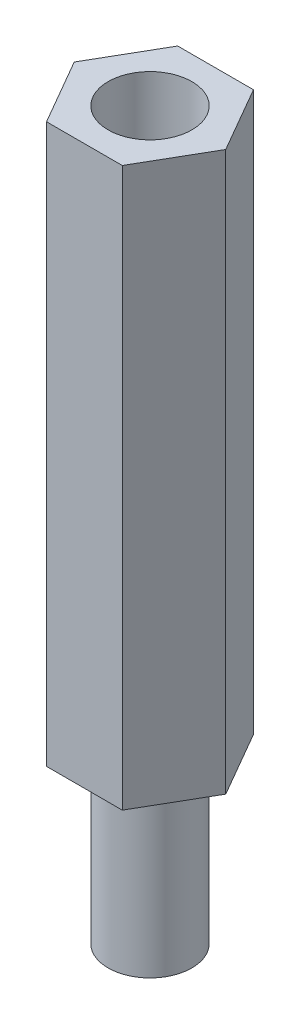
ISO-10303-21;
HEADER;
FILE_DESCRIPTION(('STEP AP214'),'2;1');
FILE_NAME('part.step','',(''),(''),'','','');
FILE_SCHEMA(('AUTOMOTIVE_DESIGN { 1 0 10303 214 1 1 1 1 }'));
ENDSEC;
DATA;
#1=APPLICATION_CONTEXT('core data for automotive mechanical design processes');
#2=APPLICATION_PROTOCOL_DEFINITION('international standard','automotive_design',2000,#1);
#3=PRODUCT_CONTEXT('',#1,'mechanical');
#4=PRODUCT('Part','Part','',(#3));
#5=PRODUCT_RELATED_PRODUCT_CATEGORY('part','',(#4));
#6=PRODUCT_DEFINITION_FORMATION('','',#4);
#7=PRODUCT_DEFINITION_CONTEXT('part definition',#1,'design');
#8=PRODUCT_DEFINITION('design','',#6,#7);
#9=PRODUCT_DEFINITION_SHAPE('','',#8);
#10=(LENGTH_UNIT() NAMED_UNIT(*) SI_UNIT(.MILLI.,.METRE.));
#11=(NAMED_UNIT(*) PLANE_ANGLE_UNIT() SI_UNIT($,.RADIAN.));
#12=(NAMED_UNIT(*) SI_UNIT($,.STERADIAN.) SOLID_ANGLE_UNIT());
#13=UNCERTAINTY_MEASURE_WITH_UNIT(LENGTH_MEASURE(1.E-05),#10,'distance_accuracy_value','');
#14=(GEOMETRIC_REPRESENTATION_CONTEXT(3) GLOBAL_UNCERTAINTY_ASSIGNED_CONTEXT((#13)) GLOBAL_UNIT_ASSIGNED_CONTEXT((#10,
#11,#12)) REPRESENTATION_CONTEXT('',''));
#15=CARTESIAN_POINT('',(0.,0.,0.));
#16=DIRECTION('',(0.,0.,1.));
#17=DIRECTION('',(1.,0.,0.));
#18=AXIS2_PLACEMENT_3D('',#15,#16,#17);
#19=CARTESIAN_POINT('',(0.,-6.,0.));
#20=DIRECTION('',(0.,1.,0.));
#21=DIRECTION('',(0.,0.,1.));
#22=AXIS2_PLACEMENT_3D('',#19,#20,#21);
#23=CYLINDRICAL_SURFACE('',#22,1.5);
#24=CARTESIAN_POINT('',(0.,-6.,0.));
#25=DIRECTION('',(0.,-1.,0.));
#26=DIRECTION('',(0.,0.,-1.));
#27=AXIS2_PLACEMENT_3D('',#24,#25,#26);
#28=CIRCLE('',#27,1.5);
#29=CARTESIAN_POINT('',(0.,-6.,-1.5));
#30=VERTEX_POINT('',#29);
#31=EDGE_CURVE('E11',#30,#30,#28,.T.);
#32=ORIENTED_EDGE('',*,*,#31,.F.);
#33=EDGE_LOOP('',(#32));
#34=FACE_BOUND('',#33,.T.);
#35=CARTESIAN_POINT('',(0.,0.,0.));
#36=DIRECTION('',(0.,-1.,0.));
#37=DIRECTION('',(0.,0.,-1.));
#38=AXIS2_PLACEMENT_3D('',#35,#36,#37);
#39=CIRCLE('',#38,1.5);
#40=CARTESIAN_POINT('',(0.,0.,-1.5));
#41=VERTEX_POINT('',#40);
#42=EDGE_CURVE('E46',#41,#41,#39,.T.);
#43=ORIENTED_EDGE('',*,*,#42,.T.);
#44=EDGE_LOOP('',(#43));
#45=FACE_BOUND('',#44,.T.);
#46=ADVANCED_FACE('F43',(#34,#45),#23,.T.);
#47=CARTESIAN_POINT('',(0.,-6.,0.));
#48=DIRECTION('',(0.,-1.,0.));
#49=DIRECTION('',(0.,0.,-1.));
#50=AXIS2_PLACEMENT_3D('',#47,#48,#49);
#51=PLANE('',#50);
#52=ORIENTED_EDGE('',*,*,#31,.T.);
#53=EDGE_LOOP('',(#52));
#54=FACE_BOUND('',#53,.T.);
#55=ADVANCED_FACE('F58',(#54),#51,.T.);
#56=CARTESIAN_POINT('',(0.,0.,0.));
#57=DIRECTION('',(0.,-1.,0.));
#58=DIRECTION('',(0.,0.,-1.));
#59=AXIS2_PLACEMENT_3D('',#56,#57,#58);
#60=PLANE('',#59);
#61=ORIENTED_EDGE('',*,*,#42,.F.);
#62=EDGE_LOOP('',(#61));
#63=FACE_BOUND('',#62,.T.);
#64=ADVANCED_FACE('F56',(#63),#60,.F.);
#65=CLOSED_SHELL('',(#46,#55,#64));
#66=MANIFOLD_SOLID_BREP('B2',#65);
#67=CARTESIAN_POINT('',(0.,20.,0.));
#68=DIRECTION('',(0.,1.,0.));
#69=DIRECTION('',(0.,0.,1.));
#70=AXIS2_PLACEMENT_3D('',#67,#68,#69);
#71=PLANE('',#70);
#72=DIRECTION('',(0.5,0.,-0.866025403784438));
#73=VECTOR('',#72,1.);
#74=CARTESIAN_POINT('',(1.35677313259562,20.,2.35));
#75=LINE('',#74,#73);
#76=CARTESIAN_POINT('',(1.35677313259562,20.,2.35));
#77=VERTEX_POINT('',#76);
#78=CARTESIAN_POINT('',(2.71354626519124,20.,0.));
#79=VERTEX_POINT('',#78);
#80=EDGE_CURVE('E180',#77,#79,#75,.T.);
#81=ORIENTED_EDGE('',*,*,#80,.T.);
#82=DIRECTION('',(-0.5,0.,-0.866025403784438));
#83=VECTOR('',#82,1.);
#84=CARTESIAN_POINT('',(2.71354626519124,20.,0.));
#85=LINE('',#84,#83);
#86=CARTESIAN_POINT('',(1.35677313259562,20.,-2.35));
#87=VERTEX_POINT('',#86);
#88=EDGE_CURVE('E138',#79,#87,#85,.T.);
#89=ORIENTED_EDGE('',*,*,#88,.T.);
#90=DIRECTION('',(-1.,0.,0.));
#91=VECTOR('',#90,1.);
#92=CARTESIAN_POINT('',(1.35677313259562,20.,-2.35));
#93=LINE('',#92,#91);
#94=CARTESIAN_POINT('',(-1.35677313259562,20.,-2.35));
#95=VERTEX_POINT('',#94);
#96=EDGE_CURVE('E151',#87,#95,#93,.T.);
#97=ORIENTED_EDGE('',*,*,#96,.T.);
#98=DIRECTION('',(-0.5,0.,0.866025403784439));
#99=VECTOR('',#98,1.);
#100=CARTESIAN_POINT('',(-1.35677313259562,20.,-2.35));
#101=LINE('',#100,#99);
#102=CARTESIAN_POINT('',(-2.71354626519124,20.,0.));
#103=VERTEX_POINT('',#102);
#104=EDGE_CURVE('E145',#95,#103,#101,.T.);
#105=ORIENTED_EDGE('',*,*,#104,.T.);
#106=DIRECTION('',(0.5,0.,0.866025403784438));
#107=VECTOR('',#106,1.);
#108=CARTESIAN_POINT('',(-2.71354626519124,20.,0.));
#109=LINE('',#108,#107);
#110=CARTESIAN_POINT('',(-1.35677313259562,20.,2.35));
#111=VERTEX_POINT('',#110);
#112=EDGE_CURVE('E149',#103,#111,#109,.T.);
#113=ORIENTED_EDGE('',*,*,#112,.T.);
#114=DIRECTION('',(1.,0.,0.));
#115=VECTOR('',#114,1.);
#116=CARTESIAN_POINT('',(-1.35677313259562,20.,2.35));
#117=LINE('',#116,#115);
#118=EDGE_CURVE('E101',#111,#77,#117,.T.);
#119=ORIENTED_EDGE('',*,*,#118,.T.);
#120=EDGE_LOOP('',(#81,#89,#97,#105,#113,#119));
#121=FACE_BOUND('',#120,.T.);
#122=CARTESIAN_POINT('',(0.,20.,0.));
#123=DIRECTION('',(0.,1.,0.));
#124=DIRECTION('',(0.,0.,1.));
#125=AXIS2_PLACEMENT_3D('',#122,#123,#124);
#126=CIRCLE('',#125,1.5);
#127=CARTESIAN_POINT('',(0.,20.,1.5));
#128=VERTEX_POINT('',#127);
#129=EDGE_CURVE('E173',#128,#128,#126,.T.);
#130=ORIENTED_EDGE('',*,*,#129,.F.);
#131=EDGE_LOOP('',(#130));
#132=FACE_BOUND('',#131,.T.);
#133=ADVANCED_FACE('F84',(#121,#132),#71,.T.);
#134=CARTESIAN_POINT('',(0.,0.,0.));
#135=DIRECTION('',(0.,1.,0.));
#136=DIRECTION('',(0.,0.,1.));
#137=AXIS2_PLACEMENT_3D('',#134,#135,#136);
#138=PLANE('',#137);
#139=DIRECTION('',(0.5,0.,-0.866025403784438));
#140=VECTOR('',#139,1.);
#141=CARTESIAN_POINT('',(1.35677313259562,0.,2.35));
#142=LINE('',#141,#140);
#143=CARTESIAN_POINT('',(1.35677313259562,0.,2.35));
#144=VERTEX_POINT('',#143);
#145=CARTESIAN_POINT('',(2.71354626519124,0.,0.));
#146=VERTEX_POINT('',#145);
#147=EDGE_CURVE('E169',#144,#146,#142,.T.);
#148=ORIENTED_EDGE('',*,*,#147,.F.);
#149=DIRECTION('',(1.,0.,0.));
#150=VECTOR('',#149,1.);
#151=CARTESIAN_POINT('',(-1.35677313259562,0.,2.35));
#152=LINE('',#151,#150);
#153=CARTESIAN_POINT('',(-1.35677313259562,0.,2.35));
#154=VERTEX_POINT('',#153);
#155=EDGE_CURVE('E130',#154,#144,#152,.T.);
#156=ORIENTED_EDGE('',*,*,#155,.F.);
#157=DIRECTION('',(0.5,0.,0.866025403784438));
#158=VECTOR('',#157,1.);
#159=CARTESIAN_POINT('',(-2.71354626519124,0.,0.));
#160=LINE('',#159,#158);
#161=CARTESIAN_POINT('',(-2.71354626519124,0.,0.));
#162=VERTEX_POINT('',#161);
#163=EDGE_CURVE('E124',#162,#154,#160,.T.);
#164=ORIENTED_EDGE('',*,*,#163,.F.);
#165=DIRECTION('',(-0.5,0.,0.866025403784439));
#166=VECTOR('',#165,1.);
#167=CARTESIAN_POINT('',(-1.35677313259562,0.,-2.35));
#168=LINE('',#167,#166);
#169=CARTESIAN_POINT('',(-1.35677313259562,0.,-2.35));
#170=VERTEX_POINT('',#169);
#171=EDGE_CURVE('E159',#170,#162,#168,.T.);
#172=ORIENTED_EDGE('',*,*,#171,.F.);
#173=DIRECTION('',(-1.,0.,0.));
#174=VECTOR('',#173,1.);
#175=CARTESIAN_POINT('',(1.35677313259562,0.,-2.35));
#176=LINE('',#175,#174);
#177=CARTESIAN_POINT('',(1.35677313259562,0.,-2.35));
#178=VERTEX_POINT('',#177);
#179=EDGE_CURVE('E175',#178,#170,#176,.T.);
#180=ORIENTED_EDGE('',*,*,#179,.F.);
#181=DIRECTION('',(-0.5,0.,-0.866025403784438));
#182=VECTOR('',#181,1.);
#183=CARTESIAN_POINT('',(2.71354626519124,0.,0.));
#184=LINE('',#183,#182);
#185=EDGE_CURVE('E172',#146,#178,#184,.T.);
#186=ORIENTED_EDGE('',*,*,#185,.F.);
#187=EDGE_LOOP('',(#148,#156,#164,#172,#180,#186));
#188=FACE_BOUND('',#187,.T.);
#189=CARTESIAN_POINT('',(0.,0.,0.));
#190=DIRECTION('',(0.,1.,0.));
#191=DIRECTION('',(0.,0.,1.));
#192=AXIS2_PLACEMENT_3D('',#189,#190,#191);
#193=CIRCLE('',#192,1.5);
#194=CARTESIAN_POINT('',(0.,0.,1.5));
#195=VERTEX_POINT('',#194);
#196=EDGE_CURVE('E273',#195,#195,#193,.T.);
#197=ORIENTED_EDGE('',*,*,#196,.T.);
#198=EDGE_LOOP('',(#197));
#199=FACE_BOUND('',#198,.T.);
#200=ADVANCED_FACE('F189',(#188,#199),#138,.F.);
#201=CARTESIAN_POINT('',(1.35677313259562,20.,2.35));
#202=DIRECTION('',(-0.866025403784439,0.,-0.5));
#203=DIRECTION('',(-0.5,0.,0.866025403784439));
#204=AXIS2_PLACEMENT_3D('',#201,#202,#203);
#205=PLANE('',#204);
#206=ORIENTED_EDGE('',*,*,#147,.T.);
#207=DIRECTION('',(0.,-1.,0.));
#208=VECTOR('',#207,1.);
#209=CARTESIAN_POINT('',(2.71354626519124,20.,0.));
#210=LINE('',#209,#208);
#211=EDGE_CURVE('E41',#79,#146,#210,.T.);
#212=ORIENTED_EDGE('',*,*,#211,.F.);
#213=ORIENTED_EDGE('',*,*,#80,.F.);
#214=DIRECTION('',(0.,-1.,0.));
#215=VECTOR('',#214,1.);
#216=CARTESIAN_POINT('',(1.35677313259562,20.,2.35));
#217=LINE('',#216,#215);
#218=EDGE_CURVE('E165',#77,#144,#217,.T.);
#219=ORIENTED_EDGE('',*,*,#218,.T.);
#220=EDGE_LOOP('',(#206,#212,#213,#219));
#221=FACE_BOUND('',#220,.T.);
#222=ADVANCED_FACE('F86',(#221),#205,.F.);
#223=CARTESIAN_POINT('',(2.71354626519124,20.,0.));
#224=DIRECTION('',(-0.866025403784438,0.,0.5));
#225=DIRECTION('',(0.5,0.,0.866025403784438));
#226=AXIS2_PLACEMENT_3D('',#223,#224,#225);
#227=PLANE('',#226);
#228=ORIENTED_EDGE('',*,*,#185,.T.);
#229=DIRECTION('',(0.,-1.,0.));
#230=VECTOR('',#229,1.);
#231=CARTESIAN_POINT('',(1.35677313259562,20.,-2.35));
#232=LINE('',#231,#230);
#233=EDGE_CURVE('E93',#87,#178,#232,.T.);
#234=ORIENTED_EDGE('',*,*,#233,.F.);
#235=ORIENTED_EDGE('',*,*,#88,.F.);
#236=ORIENTED_EDGE('',*,*,#211,.T.);
#237=EDGE_LOOP('',(#228,#234,#235,#236));
#238=FACE_BOUND('',#237,.T.);
#239=ADVANCED_FACE('F214',(#238),#227,.F.);
#240=CARTESIAN_POINT('',(1.35677313259562,20.,-2.35));
#241=DIRECTION('',(0.,0.,1.));
#242=DIRECTION('',(1.,0.,0.));
#243=AXIS2_PLACEMENT_3D('',#240,#241,#242);
#244=PLANE('',#243);
#245=ORIENTED_EDGE('',*,*,#179,.T.);
#246=DIRECTION('',(0.,-1.,0.));
#247=VECTOR('',#246,1.);
#248=CARTESIAN_POINT('',(-1.35677313259562,20.,-2.35));
#249=LINE('',#248,#247);
#250=EDGE_CURVE('E160',#95,#170,#249,.T.);
#251=ORIENTED_EDGE('',*,*,#250,.F.);
#252=ORIENTED_EDGE('',*,*,#96,.F.);
#253=ORIENTED_EDGE('',*,*,#233,.T.);
#254=EDGE_LOOP('',(#245,#251,#252,#253));
#255=FACE_BOUND('',#254,.T.);
#256=ADVANCED_FACE('F186',(#255),#244,.F.);
#257=CARTESIAN_POINT('',(-1.35677313259562,20.,-2.35));
#258=DIRECTION('',(0.866025403784439,0.,0.5));
#259=DIRECTION('',(0.5,0.,-0.866025403784439));
#260=AXIS2_PLACEMENT_3D('',#257,#258,#259);
#261=PLANE('',#260);
#262=ORIENTED_EDGE('',*,*,#171,.T.);
#263=DIRECTION('',(0.,-1.,0.));
#264=VECTOR('',#263,1.);
#265=CARTESIAN_POINT('',(-2.71354626519124,20.,0.));
#266=LINE('',#265,#264);
#267=EDGE_CURVE('E156',#103,#162,#266,.T.);
#268=ORIENTED_EDGE('',*,*,#267,.F.);
#269=ORIENTED_EDGE('',*,*,#104,.F.);
#270=ORIENTED_EDGE('',*,*,#250,.T.);
#271=EDGE_LOOP('',(#262,#268,#269,#270));
#272=FACE_BOUND('',#271,.T.);
#273=ADVANCED_FACE('F157',(#272),#261,.F.);
#274=CARTESIAN_POINT('',(-2.71354626519124,20.,0.));
#275=DIRECTION('',(0.866025403784439,0.,-0.5));
#276=DIRECTION('',(-0.5,0.,-0.866025403784439));
#277=AXIS2_PLACEMENT_3D('',#274,#275,#276);
#278=PLANE('',#277);
#279=ORIENTED_EDGE('',*,*,#163,.T.);
#280=DIRECTION('',(0.,-1.,0.));
#281=VECTOR('',#280,1.);
#282=CARTESIAN_POINT('',(-1.35677313259562,20.,2.35));
#283=LINE('',#282,#281);
#284=EDGE_CURVE('E161',#111,#154,#283,.T.);
#285=ORIENTED_EDGE('',*,*,#284,.F.);
#286=ORIENTED_EDGE('',*,*,#112,.F.);
#287=ORIENTED_EDGE('',*,*,#267,.T.);
#288=EDGE_LOOP('',(#279,#285,#286,#287));
#289=FACE_BOUND('',#288,.T.);
#290=ADVANCED_FACE('F163',(#289),#278,.F.);
#291=CARTESIAN_POINT('',(-1.35677313259562,20.,2.35));
#292=DIRECTION('',(0.,0.,-1.));
#293=DIRECTION('',(-1.,0.,0.));
#294=AXIS2_PLACEMENT_3D('',#291,#292,#293);
#295=PLANE('',#294);
#296=ORIENTED_EDGE('',*,*,#155,.T.);
#297=ORIENTED_EDGE('',*,*,#218,.F.);
#298=ORIENTED_EDGE('',*,*,#118,.F.);
#299=ORIENTED_EDGE('',*,*,#284,.T.);
#300=EDGE_LOOP('',(#296,#297,#298,#299));
#301=FACE_BOUND('',#300,.T.);
#302=ADVANCED_FACE('F194',(#301),#295,.F.);
#303=CARTESIAN_POINT('',(0.,20.,0.));
#304=DIRECTION('',(0.,-1.,0.));
#305=DIRECTION('',(0.,0.,-1.));
#306=AXIS2_PLACEMENT_3D('',#303,#304,#305);
#307=CYLINDRICAL_SURFACE('',#306,1.5);
#308=ORIENTED_EDGE('',*,*,#129,.T.);
#309=EDGE_LOOP('',(#308));
#310=FACE_BOUND('',#309,.T.);
#311=ORIENTED_EDGE('',*,*,#196,.F.);
#312=EDGE_LOOP('',(#311));
#313=FACE_BOUND('',#312,.T.);
#314=ADVANCED_FACE('F196',(#310,#313),#307,.F.);
#315=CLOSED_SHELL('',(#133,#200,#222,#239,#256,#273,#290,#302,#314));
#316=MANIFOLD_SOLID_BREP('B6',#315);
#317=ADVANCED_BREP_SHAPE_REPRESENTATION('',(#18,#66,#316),#14);
#318=SHAPE_DEFINITION_REPRESENTATION(#9,#317);
ENDSEC;
END-ISO-10303-21;
